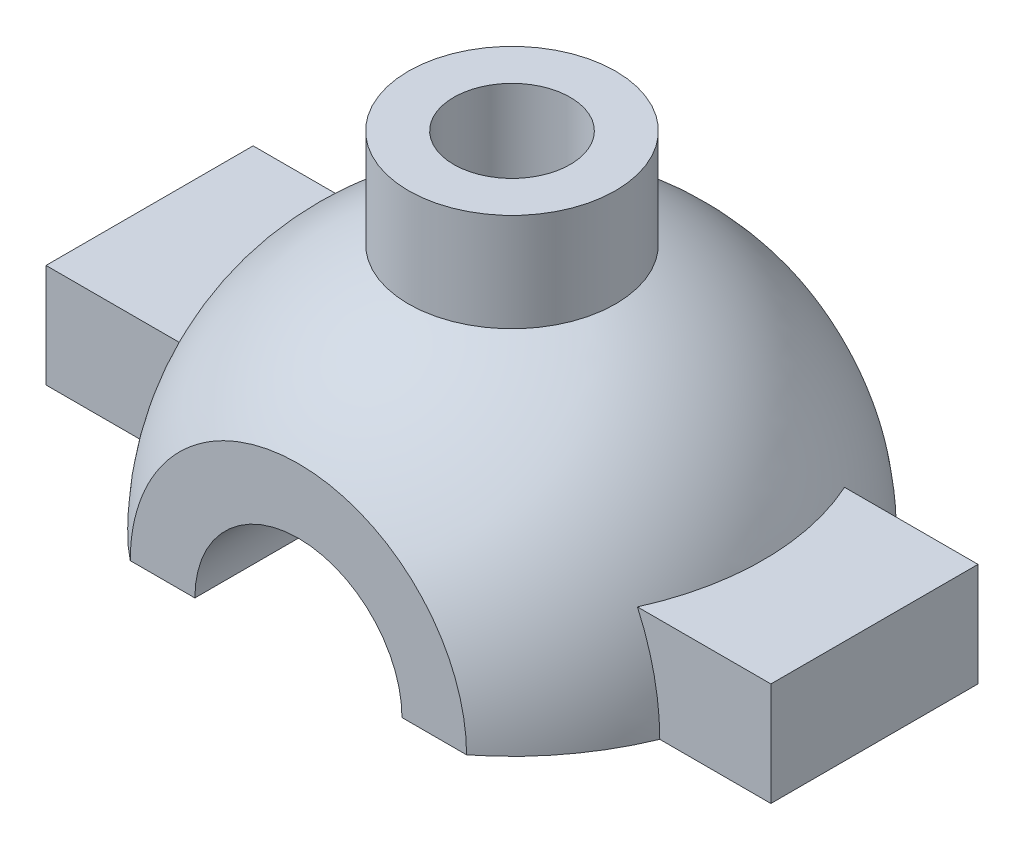
ISO-10303-21;
HEADER;
FILE_DESCRIPTION(('STEP AP214'),'2;1');
FILE_NAME('part.step','',(''),(''),'','','');
FILE_SCHEMA(('AUTOMOTIVE_DESIGN { 1 0 10303 214 1 1 1 1 }'));
ENDSEC;
DATA;
#1=APPLICATION_CONTEXT('core data for automotive mechanical design processes');
#2=APPLICATION_PROTOCOL_DEFINITION('international standard','automotive_design',2000,#1);
#3=PRODUCT_CONTEXT('',#1,'mechanical');
#4=PRODUCT('Part','Part','',(#3));
#5=PRODUCT_RELATED_PRODUCT_CATEGORY('part','',(#4));
#6=PRODUCT_DEFINITION_FORMATION('','',#4);
#7=PRODUCT_DEFINITION_CONTEXT('part definition',#1,'design');
#8=PRODUCT_DEFINITION('design','',#6,#7);
#9=PRODUCT_DEFINITION_SHAPE('','',#8);
#10=(LENGTH_UNIT() NAMED_UNIT(*) SI_UNIT(.MILLI.,.METRE.));
#11=(NAMED_UNIT(*) PLANE_ANGLE_UNIT() SI_UNIT($,.RADIAN.));
#12=(NAMED_UNIT(*) SI_UNIT($,.STERADIAN.) SOLID_ANGLE_UNIT());
#13=UNCERTAINTY_MEASURE_WITH_UNIT(LENGTH_MEASURE(1.E-05),#10,'distance_accuracy_value','');
#14=(GEOMETRIC_REPRESENTATION_CONTEXT(3) GLOBAL_UNCERTAINTY_ASSIGNED_CONTEXT((#13)) GLOBAL_UNIT_ASSIGNED_CONTEXT((#10,
#11,#12)) REPRESENTATION_CONTEXT('',''));
#15=CARTESIAN_POINT('',(0.,0.,0.));
#16=DIRECTION('',(0.,0.,1.));
#17=DIRECTION('',(1.,0.,0.));
#18=AXIS2_PLACEMENT_3D('',#15,#16,#17);
#19=CARTESIAN_POINT('',(0.,0.,0.));
#20=DIRECTION('',(0.,-1.,0.));
#21=DIRECTION('',(-0.240118786721588,0.,0.970743513119379));
#22=AXIS2_PLACEMENT_3D('',#19,#20,#21);
#23=PLANE('',#22);
#24=CARTESIAN_POINT('',(0.,0.,0.));
#25=DIRECTION('',(0.,-1.,0.));
#26=DIRECTION('',(-0.240118786721588,0.,0.970743513119379));
#27=AXIS2_PLACEMENT_3D('',#24,#25,#26);
#28=CIRCLE('',#27,21.);
#29=CARTESIAN_POINT('',(19.4164878389476,-1.41345836641282E-13,8.));
#30=VERTEX_POINT('',#29);
#31=CARTESIAN_POINT('',(12.9903810567666,-1.03980838109727E-13,16.5));
#32=VERTEX_POINT('',#31);
#33=EDGE_CURVE('E132',#30,#32,#28,.T.);
#34=ORIENTED_EDGE('',*,*,#33,.T.);
#35=DIRECTION('',(-1.,0.,0.));
#36=VECTOR('',#35,1.);
#37=CARTESIAN_POINT('',(0.,0.,16.5));
#38=LINE('',#37,#36);
#39=CARTESIAN_POINT('',(8.,0.,16.5000000000002));
#40=VERTEX_POINT('',#39);
#41=EDGE_CURVE('E149',#32,#40,#38,.T.);
#42=ORIENTED_EDGE('',*,*,#41,.T.);
#43=DIRECTION('',(0.,0.,1.));
#44=VECTOR('',#43,1.);
#45=CARTESIAN_POINT('',(8.,2.05597217397194E-12,-2500.));
#46=LINE('',#45,#44);
#47=CARTESIAN_POINT('',(8.,2.05597217397194E-12,-16.5000000000002));
#48=VERTEX_POINT('',#47);
#49=EDGE_CURVE('E143',#48,#40,#46,.T.);
#50=ORIENTED_EDGE('',*,*,#49,.F.);
#51=DIRECTION('',(1.,0.,0.));
#52=VECTOR('',#51,1.);
#53=CARTESIAN_POINT('',(0.,0.,-16.5));
#54=LINE('',#53,#52);
#55=CARTESIAN_POINT('',(12.9903810567666,0.,-16.5));
#56=VERTEX_POINT('',#55);
#57=EDGE_CURVE('E61',#48,#56,#54,.T.);
#58=ORIENTED_EDGE('',*,*,#57,.T.);
#59=CARTESIAN_POINT('',(19.4164878389476,0.,-8.));
#60=VERTEX_POINT('',#59);
#61=EDGE_CURVE('E202',#56,#60,#28,.T.);
#62=ORIENTED_EDGE('',*,*,#61,.T.);
#63=DIRECTION('',(1.,0.,0.));
#64=VECTOR('',#63,1.);
#65=CARTESIAN_POINT('',(-21.002,0.,-8.));
#66=LINE('',#65,#64);
#67=CARTESIAN_POINT('',(28.,0.,-8.));
#68=VERTEX_POINT('',#67);
#69=EDGE_CURVE('E205',#60,#68,#66,.T.);
#70=ORIENTED_EDGE('',*,*,#69,.T.);
#71=DIRECTION('',(0.,0.,-1.));
#72=VECTOR('',#71,1.);
#73=CARTESIAN_POINT('',(28.,0.,8.));
#74=LINE('',#73,#72);
#75=CARTESIAN_POINT('',(28.,0.,8.));
#76=VERTEX_POINT('',#75);
#77=EDGE_CURVE('E196',#76,#68,#74,.T.);
#78=ORIENTED_EDGE('',*,*,#77,.F.);
#79=DIRECTION('',(1.,0.,0.));
#80=VECTOR('',#79,1.);
#81=CARTESIAN_POINT('',(-21.002,0.,8.));
#82=LINE('',#81,#80);
#83=EDGE_CURVE('E213',#30,#76,#82,.T.);
#84=ORIENTED_EDGE('',*,*,#83,.F.);
#85=EDGE_LOOP('',(#34,#42,#50,#58,#62,#70,#78,#84));
#86=FACE_BOUND('',#85,.T.);
#87=ADVANCED_FACE('F39',(#86),#23,.T.);
#88=CARTESIAN_POINT('',(0.,0.,0.));
#89=DIRECTION('',(-0.120947275456336,0.,0.992658932644889));
#90=DIRECTION('',(0.992658932644889,0.,0.120947275456336));
#91=AXIS2_PLACEMENT_3D('',#88,#89,#90);
#92=SPHERICAL_SURFACE('',#91,21.);
#93=CARTESIAN_POINT('',(0.,19.4164878389476,0.));
#94=DIRECTION('',(0.,-1.,0.));
#95=DIRECTION('',(0.,0.,-1.));
#96=AXIS2_PLACEMENT_3D('',#93,#94,#95);
#97=CIRCLE('',#96,8.);
#98=CARTESIAN_POINT('',(0.,19.4164878389476,-8.));
#99=VERTEX_POINT('',#98);
#100=EDGE_CURVE('E159',#99,#99,#97,.F.);
#101=ORIENTED_EDGE('',*,*,#100,.F.);
#102=EDGE_LOOP('',(#101));
#103=FACE_BOUND('',#102,.T.);
#104=CARTESIAN_POINT('',(0.,0.,16.5));
#105=DIRECTION('',(0.,0.,1.));
#106=DIRECTION('',(1.,0.,0.));
#107=AXIS2_PLACEMENT_3D('',#104,#105,#106);
#108=CIRCLE('',#107,12.9903810567666);
#109=CARTESIAN_POINT('',(-12.9903810567666,0.,16.5));
#110=VERTEX_POINT('',#109);
#111=EDGE_CURVE('E448',#32,#110,#108,.T.);
#112=ORIENTED_EDGE('',*,*,#111,.F.);
#113=ORIENTED_EDGE('',*,*,#33,.F.);
#114=CARTESIAN_POINT('',(0.,0.,8.));
#115=DIRECTION('',(0.,0.,1.));
#116=DIRECTION('',(1.,0.,0.));
#117=AXIS2_PLACEMENT_3D('',#114,#115,#116);
#118=CIRCLE('',#117,19.4164878389476);
#119=CARTESIAN_POINT('',(17.6918060129541,7.99999999999998,8.));
#120=VERTEX_POINT('',#119);
#121=EDGE_CURVE('E211',#120,#30,#118,.F.);
#122=ORIENTED_EDGE('',*,*,#121,.F.);
#123=CARTESIAN_POINT('',(0.,7.99999999999998,0.));
#124=DIRECTION('',(0.,1.,0.));
#125=DIRECTION('',(0.,0.,1.));
#126=AXIS2_PLACEMENT_3D('',#123,#124,#125);
#127=CIRCLE('',#126,19.4164878389476);
#128=CARTESIAN_POINT('',(17.6918060129542,7.99999999999998,-8.));
#129=VERTEX_POINT('',#128);
#130=EDGE_CURVE('E207',#129,#120,#127,.F.);
#131=ORIENTED_EDGE('',*,*,#130,.F.);
#132=CARTESIAN_POINT('',(0.,0.,-8.));
#133=DIRECTION('',(0.,0.,-1.));
#134=DIRECTION('',(-1.,0.,0.));
#135=AXIS2_PLACEMENT_3D('',#132,#133,#134);
#136=CIRCLE('',#135,19.4164878389476);
#137=EDGE_CURVE('E173',#60,#129,#136,.F.);
#138=ORIENTED_EDGE('',*,*,#137,.F.);
#139=ORIENTED_EDGE('',*,*,#61,.F.);
#140=CARTESIAN_POINT('',(0.,0.,-16.5));
#141=DIRECTION('',(0.,0.,-1.));
#142=DIRECTION('',(-1.,0.,0.));
#143=AXIS2_PLACEMENT_3D('',#140,#141,#142);
#144=CIRCLE('',#143,12.9903810567666);
#145=CARTESIAN_POINT('',(-12.9903810567666,1.03980838109727E-13,-16.5));
#146=VERTEX_POINT('',#145);
#147=EDGE_CURVE('E140',#146,#56,#144,.T.);
#148=ORIENTED_EDGE('',*,*,#147,.F.);
#149=CARTESIAN_POINT('',(-19.4164878389476,1.41345836641282E-13,-8.));
#150=VERTEX_POINT('',#149);
#151=EDGE_CURVE('E139',#150,#146,#28,.T.);
#152=ORIENTED_EDGE('',*,*,#151,.F.);
#153=CARTESIAN_POINT('',(0.,0.,-8.));
#154=DIRECTION('',(0.,0.,1.));
#155=DIRECTION('',(1.,0.,0.));
#156=AXIS2_PLACEMENT_3D('',#153,#154,#155);
#157=CIRCLE('',#156,19.4164878389476);
#158=CARTESIAN_POINT('',(-17.6918060129542,7.99999999999998,-8.));
#159=VERTEX_POINT('',#158);
#160=EDGE_CURVE('E180',#150,#159,#157,.F.);
#161=ORIENTED_EDGE('',*,*,#160,.T.);
#162=CARTESIAN_POINT('',(0.,7.99999999999998,0.));
#163=DIRECTION('',(0.,-1.,0.));
#164=DIRECTION('',(0.,0.,-1.));
#165=AXIS2_PLACEMENT_3D('',#162,#163,#164);
#166=CIRCLE('',#165,19.4164878389476);
#167=CARTESIAN_POINT('',(-17.6918060129541,7.99999999999998,8.));
#168=VERTEX_POINT('',#167);
#169=EDGE_CURVE('E162',#159,#168,#166,.F.);
#170=ORIENTED_EDGE('',*,*,#169,.T.);
#171=CARTESIAN_POINT('',(0.,0.,8.));
#172=DIRECTION('',(0.,0.,-1.));
#173=DIRECTION('',(-1.,0.,0.));
#174=AXIS2_PLACEMENT_3D('',#171,#172,#173);
#175=CIRCLE('',#174,19.4164878389476);
#176=CARTESIAN_POINT('',(-19.4164878389476,0.,8.));
#177=VERTEX_POINT('',#176);
#178=EDGE_CURVE('E187',#168,#177,#175,.F.);
#179=ORIENTED_EDGE('',*,*,#178,.T.);
#180=EDGE_CURVE('E220',#110,#177,#28,.T.);
#181=ORIENTED_EDGE('',*,*,#180,.F.);
#182=EDGE_LOOP('',(#112,#113,#122,#131,#138,#139,#148,#152,#161,#170,#179,#181));
#183=FACE_BOUND('',#182,.T.);
#184=ADVANCED_FACE('F41',(#103,#183),#92,.T.);
#185=DIRECTION('',(0.,0.,1.));
#186=VECTOR('',#185,1.);
#187=CARTESIAN_POINT('',(-8.,2.16687937842524E-12,-2500.));
#188=LINE('',#187,#186);
#189=CARTESIAN_POINT('',(-8.,2.16687937842524E-12,16.5000000000002));
#190=VERTEX_POINT('',#189);
#191=CARTESIAN_POINT('',(-8.,0.,-16.5000000000002));
#192=VERTEX_POINT('',#191);
#193=EDGE_CURVE('E137',#190,#192,#188,.F.);
#194=ORIENTED_EDGE('',*,*,#193,.F.);
#195=DIRECTION('',(-1.,0.,0.));
#196=VECTOR('',#195,1.);
#197=CARTESIAN_POINT('',(0.,0.,16.5));
#198=LINE('',#197,#196);
#199=EDGE_CURVE('E53',#190,#110,#198,.T.);
#200=ORIENTED_EDGE('',*,*,#199,.T.);
#201=ORIENTED_EDGE('',*,*,#180,.T.);
#202=DIRECTION('',(-1.,0.,0.));
#203=VECTOR('',#202,1.);
#204=CARTESIAN_POINT('',(28.002,0.,8.));
#205=LINE('',#204,#203);
#206=CARTESIAN_POINT('',(-28.,0.,8.));
#207=VERTEX_POINT('',#206);
#208=EDGE_CURVE('E179',#177,#207,#205,.T.);
#209=ORIENTED_EDGE('',*,*,#208,.T.);
#210=DIRECTION('',(0.,0.,-1.));
#211=VECTOR('',#210,1.);
#212=CARTESIAN_POINT('',(-28.,0.,8.));
#213=LINE('',#212,#211);
#214=CARTESIAN_POINT('',(-28.,0.,-8.));
#215=VERTEX_POINT('',#214);
#216=EDGE_CURVE('E167',#207,#215,#213,.T.);
#217=ORIENTED_EDGE('',*,*,#216,.T.);
#218=DIRECTION('',(-1.,0.,0.));
#219=VECTOR('',#218,1.);
#220=CARTESIAN_POINT('',(28.002,0.,-8.));
#221=LINE('',#220,#219);
#222=EDGE_CURVE('E177',#150,#215,#221,.T.);
#223=ORIENTED_EDGE('',*,*,#222,.F.);
#224=ORIENTED_EDGE('',*,*,#151,.T.);
#225=DIRECTION('',(1.,0.,0.));
#226=VECTOR('',#225,1.);
#227=CARTESIAN_POINT('',(0.,0.,-16.5));
#228=LINE('',#227,#226);
#229=EDGE_CURVE('E126',#146,#192,#228,.T.);
#230=ORIENTED_EDGE('',*,*,#229,.T.);
#231=EDGE_LOOP('',(#194,#200,#201,#209,#217,#223,#224,#230));
#232=FACE_BOUND('',#231,.T.);
#233=ADVANCED_FACE('F136',(#232),#23,.T.);
#234=CARTESIAN_POINT('',(0.,0.,-2500.));
#235=DIRECTION('',(0.,0.,1.));
#236=DIRECTION('',(1.,0.,0.));
#237=AXIS2_PLACEMENT_3D('',#234,#235,#236);
#238=CYLINDRICAL_SURFACE('',#237,8.);
#239=CARTESIAN_POINT('',(0.,7.99999999999993,4.5));
#240=CARTESIAN_POINT('',(-0.116543823570619,8.00000052321529,4.5000005774101));
#241=CARTESIAN_POINT('',(-0.233079795703435,7.99744790812885,4.49546758690245));
#242=CARTESIAN_POINT('',(-0.465270151944618,7.98730443127847,4.47739747127478));
#243=CARTESIAN_POINT('',(-0.580924226207909,7.9797118744594,4.46385731682291));
#244=CARTESIAN_POINT('',(-0.810388464245207,7.9596811192482,4.42795065478273));
#245=CARTESIAN_POINT('',(-0.924199245013676,7.94724457869088,4.40558716691247));
#246=CARTESIAN_POINT('',(-1.14922234674692,7.91784044878558,4.35231914234516));
#247=CARTESIAN_POINT('',(-1.26043357938736,7.90087099737581,4.32141109546996));
#248=CARTESIAN_POINT('',(-1.58812679273737,7.84389549435277,4.21665569126856));
#249=CARTESIAN_POINT('',(-1.79978077725277,7.79771937220035,4.13059900676703));
#250=CARTESIAN_POINT('',(-2.20510624255204,7.69295137021081,3.92923225890187));
#251=CARTESIAN_POINT('',(-2.39877326635644,7.63435642486231,3.81391497134683));
#252=CARTESIAN_POINT('',(-2.77812685249775,7.50499250308751,3.54814667669052));
#253=CARTESIAN_POINT('',(-2.96228371416652,7.43365599089749,3.39578949232319));
#254=CARTESIAN_POINT('',(-3.30389486281481,7.28826664842056,3.06447414015761));
#255=CARTESIAN_POINT('',(-3.46132099412809,7.21421105270879,2.88548829183571));
#256=CARTESIAN_POINT('',(-3.76164502791232,7.06265953898555,2.48381183967546));
#257=CARTESIAN_POINT('',(-3.90130374753583,6.98561328253138,2.25850841376943));
#258=CARTESIAN_POINT('',(-4.14014907389796,6.84677754970072,1.78315426263204));
#259=CARTESIAN_POINT('',(-4.23939496634799,6.78496577726986,1.53314046209072));
#260=CARTESIAN_POINT('',(-4.3759483199784,6.69747580925639,1.07055407910655));
#261=CARTESIAN_POINT('',(-4.4219847267625,6.66688623100246,0.861487883526946));
#262=CARTESIAN_POINT('',(-4.48383874455943,6.62545397543909,0.437091535239554));
#263=CARTESIAN_POINT('',(-4.4996872312577,6.61459112250516,0.221768011583065));
#264=CARTESIAN_POINT('',(-4.50030399499223,6.61417140184267,-0.209197381278784));
#265=CARTESIAN_POINT('',(-4.48503471210723,6.6246402820439,-0.424839320884229));
#266=CARTESIAN_POINT('',(-4.42422874706652,6.66539450121533,-0.849925242962161));
#267=CARTESIAN_POINT('',(-4.37867190170004,6.69569304109151,-1.05936499939537));
#268=CARTESIAN_POINT('',(-4.25958455399931,6.77206570342874,-1.46660518079691));
#269=CARTESIAN_POINT('',(-4.18609576641052,6.8181162909043,-1.66442245707891));
#270=CARTESIAN_POINT('',(-4.01366205064974,6.92102384791652,-2.04556026194928));
#271=CARTESIAN_POINT('',(-3.91470725715816,6.9778850031425,-2.22887513636523));
#272=CARTESIAN_POINT('',(-3.67636939094869,7.10671414157914,-2.60606028478132));
#273=CARTESIAN_POINT('',(-3.53309152550363,7.17965606599753,-2.79713476046929));
#274=CARTESIAN_POINT('',(-3.2181704684429,7.32622072498596,-3.1543744139039));
#275=CARTESIAN_POINT('',(-3.04650410076269,7.39984396903026,-3.32051902603745));
#276=CARTESIAN_POINT('',(-2.76007190223046,7.50959434252209,-3.55661734009427));
#277=CARTESIAN_POINT('',(-2.65407481724933,7.54780013266874,-3.63642379972455));
#278=CARTESIAN_POINT('',(-2.43478183845624,7.62136391667969,-3.78675193243844));
#279=CARTESIAN_POINT('',(-2.32148896002975,7.65672307364599,-3.85727740517988));
#280=CARTESIAN_POINT('',(-2.08821134685703,7.72360667585908,-3.98839294270912));
#281=CARTESIAN_POINT('',(-1.96822656498416,7.75513109409536,-4.04898293751609));
#282=CARTESIAN_POINT('',(-1.72240201673471,7.8134032199655,-4.15950417561569));
#283=CARTESIAN_POINT('',(-1.59656583093725,7.84015380154477,-4.20944183538886));
#284=CARTESIAN_POINT('',(-1.34889653671019,7.88639489462278,-4.29493003032402));
#285=CARTESIAN_POINT('',(-1.22739619269421,7.90626159497848,-4.33124099607139));
#286=CARTESIAN_POINT('',(-0.981096813949634,7.9405853674248,-4.39358328000511));
#287=CARTESIAN_POINT('',(-0.856299573095789,7.95504531901987,-4.41962007038037));
#288=CARTESIAN_POINT('',(-0.604481012017284,7.97813139248404,-4.46103982037235));
#289=CARTESIAN_POINT('',(-0.477460896856915,7.98676058060234,-4.47642837972366));
#290=CARTESIAN_POINT('',(-0.22230964327977,7.99792963198572,-4.4963260018538));
#291=CARTESIAN_POINT('',(-0.0941786219246132,8.00047012920376,-4.50083619728544));
#292=CARTESIAN_POINT('',(0.146955263115629,7.99944978924744,-4.49902148144578));
#293=CARTESIAN_POINT('',(0.259972352796008,7.99656869156783,-4.49390371011984));
#294=CARTESIAN_POINT('',(0.485118345436738,7.9860731380086,-4.47520103074659));
#295=CARTESIAN_POINT('',(0.597246958409322,7.97845719636498,-4.46161346492796));
#296=CARTESIAN_POINT('',(0.819733370879218,7.95867450152036,-4.42614028687614));
#297=CARTESIAN_POINT('',(0.930091829220039,7.94650948447449,-4.40425784034151));
#298=CARTESIAN_POINT('',(1.14835721779675,7.91791769020836,-4.35245670192524));
#299=CARTESIAN_POINT('',(1.25626318556237,7.90148927020136,-4.32253491214332));
#300=CARTESIAN_POINT('',(1.57380333084866,7.84658626680781,-4.22162805992803));
#301=CARTESIAN_POINT('',(1.77894612525906,7.80233553234265,-4.13922663956716));
#302=CARTESIAN_POINT('',(2.1725679251007,7.70203600584336,-3.94690573485973));
#303=CARTESIAN_POINT('',(2.36104265180591,7.64598419686167,-3.83697921235112));
#304=CARTESIAN_POINT('',(2.737142457649,7.52005945974145,-3.57982652330623));
#305=CARTESIAN_POINT('',(2.92265545750517,7.44935620114608,-3.42991552707893));
#306=CARTESIAN_POINT('',(3.2673189445025,7.30476922491346,-3.10340040682183));
#307=CARTESIAN_POINT('',(3.42643944481761,7.23088200811579,-2.92676635004101));
#308=CARTESIAN_POINT('',(3.73084592099474,7.07902884969005,-2.52977975325764));
#309=CARTESIAN_POINT('',(3.8729031554911,7.00145453617368,-2.30678114669064));
#310=CARTESIAN_POINT('',(4.11703738728757,6.86075487646599,-1.83578456875717));
#311=CARTESIAN_POINT('',(4.21916966129663,6.79760960376876,-1.58782176354465));
#312=CARTESIAN_POINT('',(4.36168923364449,6.70680610618871,-1.1273357423576));
#313=CARTESIAN_POINT('',(4.41055402945785,6.67447314136352,-0.918360760023167));
#314=CARTESIAN_POINT('',(4.47799990865622,6.6294213541255,-0.493591473810568));
#315=CARTESIAN_POINT('',(4.49661307531013,6.61668175280486,-0.277804642226758));
#316=CARTESIAN_POINT('',(4.50254552060759,6.61264720165025,0.154740855661353));
#317=CARTESIAN_POINT('',(4.48981583511714,6.6213858052569,0.371500513842658));
#318=CARTESIAN_POINT('',(4.43371141641371,6.65907583285985,0.799252006039803));
#319=CARTESIAN_POINT('',(4.39031710153559,6.68804017236531,1.01024006498534));
#320=CARTESIAN_POINT('',(4.27556707237746,6.7619580821392,1.41925662754246));
#321=CARTESIAN_POINT('',(4.20446685035885,6.80676521668524,1.61738478059851));
#322=CARTESIAN_POINT('',(4.03679617255256,6.90751871646157,1.99946244036856));
#323=CARTESIAN_POINT('',(3.9402160588841,6.96346930352358,2.18340653653014));
#324=CARTESIAN_POINT('',(3.70733773331344,7.09054325663946,2.56168761185365));
#325=CARTESIAN_POINT('',(3.56722948168695,7.16267943219351,2.7533355668854));
#326=CARTESIAN_POINT('',(3.25880845039843,7.30816042360089,3.11225955391169));
#327=CARTESIAN_POINT('',(3.09047265721716,7.38150618125594,3.27951548970075));
#328=CARTESIAN_POINT('',(2.80872946763574,7.4915146305348,3.51831036173519));
#329=CARTESIAN_POINT('',(2.70402045982264,7.53003510914692,3.59943038112193));
#330=CARTESIAN_POINT('',(2.48722991515019,7.60439317742495,3.75250266783511));
#331=CARTESIAN_POINT('',(2.37515134432033,7.64023183417722,3.82445858960599));
#332=CARTESIAN_POINT('',(2.14419470371645,7.70823751301327,3.95856854009122));
#333=CARTESIAN_POINT('',(2.02531582134412,7.7404040949236,4.020721394047));
#334=CARTESIAN_POINT('',(1.78157751649335,7.8001095107738,4.13449553302607));
#335=CARTESIAN_POINT('',(1.65672165826175,7.82765105964826,4.18612300037953));
#336=CARTESIAN_POINT('',(1.40823353799575,7.87604567493838,4.27591546056971));
#337=CARTESIAN_POINT('',(1.28484865367601,7.89716305295582,4.31462185391907));
#338=CARTESIAN_POINT('',(1.03448599473077,7.93384092023377,4.3813937163139));
#339=CARTESIAN_POINT('',(0.907510191792024,7.94940439744238,4.40946490750431));
#340=CARTESIAN_POINT('',(0.651089750028876,7.97450109935225,4.45455033605231));
#341=CARTESIAN_POINT('',(0.521646486832915,7.98403758838239,4.47157055895678));
#342=CARTESIAN_POINT('',(0.261465430831074,7.99678641182962,4.49429447044404));
#343=CARTESIAN_POINT('',(0.13072777599026,7.9999994131067,4.49999935231627));
#344=CARTESIAN_POINT('',(0.,7.99999999999993,4.5));
#345=B_SPLINE_CURVE_WITH_KNOTS('',3,(#239,#240,#241,#242,#243,#244,#245,#246,#247,#248,#249,
#250,#251,#252,#253,#254,#255,#256,#257,#258,#259,#260,#261,#262,#263,#264,#265,#266,#267,#268,
#269,#270,#271,#272,#273,#274,#275,#276,#277,#278,#279,#280,#281,#282,#283,#284,#285,#286,#287,
#288,#289,#290,#291,#292,#293,#294,#295,#296,#297,#298,#299,#300,#301,#302,#303,#304,#305,#306,
#307,#308,#309,#310,#311,#312,#313,#314,#315,#316,#317,#318,#319,#320,#321,#322,#323,#324,#325,
#326,#327,#328,#329,#330,#331,#332,#333,#334,#335,#336,#337,#338,#339,#340,#341,#342,#343,#344),
.UNSPECIFIED.,.T.,.F.,(4,2,2,2,2,2,2,2,2,2,2,2,2,2,2,2,2,2,2,2,2,2,2,2,2,2,2,2,2,2,2,2,2,2,2,2,
2,2,2,2,2,2,2,2,2,2,2,2,2,2,2,2,4),(0.,0.349502030262855,0.699121666166448,1.04862175108623,
1.39826562754571,2.09420263245155,2.79031162569059,3.53558510222788,4.28163877543937,
5.10568415677366,5.92851626825673,6.57444698242153,7.2197166942785,7.86576572400457,
8.51224527646451,9.15776311862482,9.80353140646749,10.5497800741122,11.2966410062115,
11.7104081866449,12.1240054393009,12.5376056050161,12.9509559289268,13.3354818358556,
13.7198026608493,14.1039212237448,14.4879997905754,14.8270951139622,15.1662968970543,
15.5053693556544,15.8445726611291,16.5178930651158,17.1913858130992,17.9346720555677,
18.6787971098099,19.5013982860675,20.322856490393,20.9711481533515,21.6187518229445,
22.267367827528,22.9163983967914,23.5595803584323,24.2030064624638,24.9444999748075,
25.6866009821156,26.0999832456216,26.5132001415626,26.926466518124,27.3394894492486,
27.7319930713047,28.1242852104983,28.5163646944715,28.9084028284586),.UNSPECIFIED.);
#346=CARTESIAN_POINT('',(0.,7.99999999999993,4.5));
#347=VERTEX_POINT('',#346);
#348=EDGE_CURVE('E144',#347,#347,#345,.T.);
#349=ORIENTED_EDGE('',*,*,#348,.F.);
#350=EDGE_LOOP('',(#349));
#351=FACE_BOUND('',#350,.T.);
#352=CARTESIAN_POINT('',(0.,0.,16.5000000000002));
#353=DIRECTION('',(0.,0.,1.));
#354=DIRECTION('',(1.,0.,0.));
#355=AXIS2_PLACEMENT_3D('',#352,#353,#354);
#356=CIRCLE('',#355,8.);
#357=EDGE_CURVE('E12',#190,#40,#356,.F.);
#358=ORIENTED_EDGE('',*,*,#357,.F.);
#359=ORIENTED_EDGE('',*,*,#193,.T.);
#360=CARTESIAN_POINT('',(0.,0.,-16.5000000000002));
#361=DIRECTION('',(0.,0.,-1.));
#362=DIRECTION('',(-1.,0.,0.));
#363=AXIS2_PLACEMENT_3D('',#360,#361,#362);
#364=CIRCLE('',#363,8.);
#365=EDGE_CURVE('E47',#48,#192,#364,.F.);
#366=ORIENTED_EDGE('',*,*,#365,.F.);
#367=ORIENTED_EDGE('',*,*,#49,.T.);
#368=EDGE_LOOP('',(#358,#359,#366,#367));
#369=FACE_BOUND('',#368,.T.);
#370=ADVANCED_FACE('F142',(#351,#369),#238,.F.);
#371=CARTESIAN_POINT('',(-21.002,7.99999999999998,8.));
#372=DIRECTION('',(0.,1.,0.));
#373=DIRECTION('',(0.,0.,1.));
#374=AXIS2_PLACEMENT_3D('',#371,#372,#373);
#375=PLANE('',#374);
#376=DIRECTION('',(1.,0.,0.));
#377=VECTOR('',#376,1.);
#378=CARTESIAN_POINT('',(-21.002,7.99999999999998,-8.));
#379=LINE('',#378,#377);
#380=CARTESIAN_POINT('',(28.,7.99999999999998,-8.));
#381=VERTEX_POINT('',#380);
#382=EDGE_CURVE('E208',#129,#381,#379,.T.);
#383=ORIENTED_EDGE('',*,*,#382,.F.);
#384=ORIENTED_EDGE('',*,*,#130,.T.);
#385=DIRECTION('',(1.,0.,0.));
#386=VECTOR('',#385,1.);
#387=CARTESIAN_POINT('',(-21.002,7.99999999999998,8.));
#388=LINE('',#387,#386);
#389=CARTESIAN_POINT('',(28.,7.99999999999998,8.));
#390=VERTEX_POINT('',#389);
#391=EDGE_CURVE('E210',#120,#390,#388,.T.);
#392=ORIENTED_EDGE('',*,*,#391,.T.);
#393=DIRECTION('',(0.,0.,1.));
#394=VECTOR('',#393,1.);
#395=CARTESIAN_POINT('',(28.,7.99999999999998,8.));
#396=LINE('',#395,#394);
#397=EDGE_CURVE('E195',#381,#390,#396,.T.);
#398=ORIENTED_EDGE('',*,*,#397,.F.);
#399=EDGE_LOOP('',(#383,#384,#392,#398));
#400=FACE_BOUND('',#399,.T.);
#401=ADVANCED_FACE('F232',(#400),#375,.T.);
#402=CARTESIAN_POINT('',(-21.002,0.,8.));
#403=DIRECTION('',(0.,0.,1.));
#404=DIRECTION('',(1.,0.,0.));
#405=AXIS2_PLACEMENT_3D('',#402,#403,#404);
#406=PLANE('',#405);
#407=ORIENTED_EDGE('',*,*,#391,.F.);
#408=ORIENTED_EDGE('',*,*,#121,.T.);
#409=ORIENTED_EDGE('',*,*,#83,.T.);
#410=DIRECTION('',(0.,-1.,0.));
#411=VECTOR('',#410,1.);
#412=CARTESIAN_POINT('',(28.,0.,8.));
#413=LINE('',#412,#411);
#414=EDGE_CURVE('E192',#390,#76,#413,.T.);
#415=ORIENTED_EDGE('',*,*,#414,.F.);
#416=EDGE_LOOP('',(#407,#408,#409,#415));
#417=FACE_BOUND('',#416,.T.);
#418=ADVANCED_FACE('F264',(#417),#406,.T.);
#419=CARTESIAN_POINT('',(28.,0.,0.));
#420=DIRECTION('',(-1.,0.,0.));
#421=DIRECTION('',(0.,0.,1.));
#422=AXIS2_PLACEMENT_3D('',#419,#420,#421);
#423=PLANE('',#422);
#424=DIRECTION('',(0.,1.,0.));
#425=VECTOR('',#424,1.);
#426=CARTESIAN_POINT('',(28.,0.,-8.));
#427=LINE('',#426,#425);
#428=EDGE_CURVE('E199',#68,#381,#427,.T.);
#429=ORIENTED_EDGE('',*,*,#428,.T.);
#430=ORIENTED_EDGE('',*,*,#397,.T.);
#431=ORIENTED_EDGE('',*,*,#414,.T.);
#432=ORIENTED_EDGE('',*,*,#77,.T.);
#433=EDGE_LOOP('',(#429,#430,#431,#432));
#434=FACE_BOUND('',#433,.T.);
#435=ADVANCED_FACE('F273',(#434),#423,.F.);
#436=CARTESIAN_POINT('',(-21.002,0.,-8.));
#437=DIRECTION('',(0.,0.,-1.));
#438=DIRECTION('',(-1.,0.,0.));
#439=AXIS2_PLACEMENT_3D('',#436,#437,#438);
#440=PLANE('',#439);
#441=ORIENTED_EDGE('',*,*,#69,.F.);
#442=ORIENTED_EDGE('',*,*,#137,.T.);
#443=ORIENTED_EDGE('',*,*,#382,.T.);
#444=ORIENTED_EDGE('',*,*,#428,.F.);
#445=EDGE_LOOP('',(#441,#442,#443,#444));
#446=FACE_BOUND('',#445,.T.);
#447=ADVANCED_FACE('F234',(#446),#440,.T.);
#448=CARTESIAN_POINT('',(28.002,0.,8.));
#449=DIRECTION('',(0.,0.,-1.));
#450=DIRECTION('',(-1.,0.,0.));
#451=AXIS2_PLACEMENT_3D('',#448,#449,#450);
#452=PLANE('',#451);
#453=ORIENTED_EDGE('',*,*,#178,.F.);
#454=DIRECTION('',(-1.,0.,0.));
#455=VECTOR('',#454,1.);
#456=CARTESIAN_POINT('',(28.002,7.99999999999998,8.));
#457=LINE('',#456,#455);
#458=CARTESIAN_POINT('',(-28.,7.99999999999998,8.));
#459=VERTEX_POINT('',#458);
#460=EDGE_CURVE('E182',#168,#459,#457,.T.);
#461=ORIENTED_EDGE('',*,*,#460,.T.);
#462=DIRECTION('',(0.,-1.,0.));
#463=VECTOR('',#462,1.);
#464=CARTESIAN_POINT('',(-28.,0.,8.));
#465=LINE('',#464,#463);
#466=EDGE_CURVE('E163',#459,#207,#465,.T.);
#467=ORIENTED_EDGE('',*,*,#466,.T.);
#468=ORIENTED_EDGE('',*,*,#208,.F.);
#469=EDGE_LOOP('',(#453,#461,#467,#468));
#470=FACE_BOUND('',#469,.T.);
#471=ADVANCED_FACE('F288',(#470),#452,.F.);
#472=CARTESIAN_POINT('',(-28.,0.,0.));
#473=DIRECTION('',(1.,0.,0.));
#474=DIRECTION('',(0.,0.,1.));
#475=AXIS2_PLACEMENT_3D('',#472,#473,#474);
#476=PLANE('',#475);
#477=DIRECTION('',(0.,1.,0.));
#478=VECTOR('',#477,1.);
#479=CARTESIAN_POINT('',(-28.,0.,-8.));
#480=LINE('',#479,#478);
#481=CARTESIAN_POINT('',(-28.,7.99999999999998,-8.));
#482=VERTEX_POINT('',#481);
#483=EDGE_CURVE('E170',#215,#482,#480,.T.);
#484=ORIENTED_EDGE('',*,*,#483,.F.);
#485=ORIENTED_EDGE('',*,*,#216,.F.);
#486=ORIENTED_EDGE('',*,*,#466,.F.);
#487=DIRECTION('',(0.,0.,1.));
#488=VECTOR('',#487,1.);
#489=CARTESIAN_POINT('',(-28.,7.99999999999998,8.));
#490=LINE('',#489,#488);
#491=EDGE_CURVE('E166',#482,#459,#490,.T.);
#492=ORIENTED_EDGE('',*,*,#491,.F.);
#493=EDGE_LOOP('',(#484,#485,#486,#492));
#494=FACE_BOUND('',#493,.T.);
#495=ADVANCED_FACE('F295',(#494),#476,.F.);
#496=CARTESIAN_POINT('',(28.002,0.,-8.));
#497=DIRECTION('',(0.,0.,1.));
#498=DIRECTION('',(1.,0.,0.));
#499=AXIS2_PLACEMENT_3D('',#496,#497,#498);
#500=PLANE('',#499);
#501=ORIENTED_EDGE('',*,*,#160,.F.);
#502=ORIENTED_EDGE('',*,*,#222,.T.);
#503=ORIENTED_EDGE('',*,*,#483,.T.);
#504=DIRECTION('',(-1.,0.,0.));
#505=VECTOR('',#504,1.);
#506=CARTESIAN_POINT('',(28.002,7.99999999999998,-8.));
#507=LINE('',#506,#505);
#508=EDGE_CURVE('E176',#159,#482,#507,.T.);
#509=ORIENTED_EDGE('',*,*,#508,.F.);
#510=EDGE_LOOP('',(#501,#502,#503,#509));
#511=FACE_BOUND('',#510,.T.);
#512=ADVANCED_FACE('F304',(#511),#500,.F.);
#513=CARTESIAN_POINT('',(28.002,7.99999999999998,8.));
#514=DIRECTION('',(0.,-1.,0.));
#515=DIRECTION('',(0.,0.,-1.));
#516=AXIS2_PLACEMENT_3D('',#513,#514,#515);
#517=PLANE('',#516);
#518=ORIENTED_EDGE('',*,*,#169,.F.);
#519=ORIENTED_EDGE('',*,*,#508,.T.);
#520=ORIENTED_EDGE('',*,*,#491,.T.);
#521=ORIENTED_EDGE('',*,*,#460,.F.);
#522=EDGE_LOOP('',(#518,#519,#520,#521));
#523=FACE_BOUND('',#522,.T.);
#524=ADVANCED_FACE('F267',(#523),#517,.F.);
#525=CARTESIAN_POINT('',(0.,27.,0.));
#526=DIRECTION('',(0.,1.,0.));
#527=DIRECTION('',(0.,0.,1.));
#528=AXIS2_PLACEMENT_3D('',#525,#526,#527);
#529=PLANE('',#528);
#530=CARTESIAN_POINT('',(0.,27.,0.));
#531=DIRECTION('',(0.,1.,0.));
#532=DIRECTION('',(0.,0.,1.));
#533=AXIS2_PLACEMENT_3D('',#530,#531,#532);
#534=CIRCLE('',#533,4.5);
#535=CARTESIAN_POINT('',(0.,27.,4.5));
#536=VERTEX_POINT('',#535);
#537=EDGE_CURVE('E146',#536,#536,#534,.T.);
#538=ORIENTED_EDGE('',*,*,#537,.F.);
#539=EDGE_LOOP('',(#538));
#540=FACE_BOUND('',#539,.T.);
#541=CARTESIAN_POINT('',(0.,27.,0.));
#542=DIRECTION('',(0.,1.,0.));
#543=DIRECTION('',(0.,0.,1.));
#544=AXIS2_PLACEMENT_3D('',#541,#542,#543);
#545=CIRCLE('',#544,8.);
#546=CARTESIAN_POINT('',(0.,27.,8.));
#547=VERTEX_POINT('',#546);
#548=EDGE_CURVE('E156',#547,#547,#545,.T.);
#549=ORIENTED_EDGE('',*,*,#548,.T.);
#550=EDGE_LOOP('',(#549));
#551=FACE_BOUND('',#550,.T.);
#552=ADVANCED_FACE('F319',(#540,#551),#529,.T.);
#553=CARTESIAN_POINT('',(0.,-0.00199999999998118,0.));
#554=DIRECTION('',(0.,1.,0.));
#555=DIRECTION('',(0.,0.,1.));
#556=AXIS2_PLACEMENT_3D('',#553,#554,#555);
#557=CYLINDRICAL_SURFACE('',#556,8.);
#558=ORIENTED_EDGE('',*,*,#548,.F.);
#559=EDGE_LOOP('',(#558));
#560=FACE_BOUND('',#559,.T.);
#561=ORIENTED_EDGE('',*,*,#100,.T.);
#562=EDGE_LOOP('',(#561));
#563=FACE_BOUND('',#562,.T.);
#564=ADVANCED_FACE('F298',(#560,#563),#557,.T.);
#565=CARTESIAN_POINT('',(0.,-1.42247325030098E-13,0.));
#566=DIRECTION('',(0.,1.,0.));
#567=DIRECTION('',(0.,0.,1.));
#568=AXIS2_PLACEMENT_3D('',#565,#566,#567);
#569=CYLINDRICAL_SURFACE('',#568,4.5);
#570=ORIENTED_EDGE('',*,*,#348,.T.);
#571=EDGE_LOOP('',(#570));
#572=FACE_BOUND('',#571,.T.);
#573=ORIENTED_EDGE('',*,*,#537,.T.);
#574=EDGE_LOOP('',(#573));
#575=FACE_BOUND('',#574,.T.);
#576=ADVANCED_FACE('F226',(#572,#575),#569,.F.);
#577=CARTESIAN_POINT('',(-100.,-33.,-16.5));
#578=DIRECTION('',(0.,0.,-1.));
#579=DIRECTION('',(-1.,0.,0.));
#580=AXIS2_PLACEMENT_3D('',#577,#578,#579);
#581=PLANE('',#580);
#582=ORIENTED_EDGE('',*,*,#365,.T.);
#583=ORIENTED_EDGE('',*,*,#229,.F.);
#584=ORIENTED_EDGE('',*,*,#147,.T.);
#585=ORIENTED_EDGE('',*,*,#57,.F.);
#586=EDGE_LOOP('',(#582,#583,#584,#585));
#587=FACE_BOUND('',#586,.T.);
#588=ADVANCED_FACE('F125',(#587),#581,.T.);
#589=CARTESIAN_POINT('',(-100.,-33.,16.5));
#590=DIRECTION('',(0.,0.,1.));
#591=DIRECTION('',(1.,0.,0.));
#592=AXIS2_PLACEMENT_3D('',#589,#590,#591);
#593=PLANE('',#592);
#594=ORIENTED_EDGE('',*,*,#111,.T.);
#595=ORIENTED_EDGE('',*,*,#199,.F.);
#596=ORIENTED_EDGE('',*,*,#357,.T.);
#597=ORIENTED_EDGE('',*,*,#41,.F.);
#598=EDGE_LOOP('',(#594,#595,#596,#597));
#599=FACE_BOUND('',#598,.T.);
#600=ADVANCED_FACE('F237',(#599),#593,.T.);
#601=CLOSED_SHELL('',(#87,#184,#233,#370,#401,#418,#435,#447,#471,#495,#512,#524,#552,#564,#576,
#588,#600));
#602=MANIFOLD_SOLID_BREP('B2',#601);
#603=ADVANCED_BREP_SHAPE_REPRESENTATION('',(#18,#602),#14);
#604=SHAPE_DEFINITION_REPRESENTATION(#9,#603);
ENDSEC;
END-ISO-10303-21;
